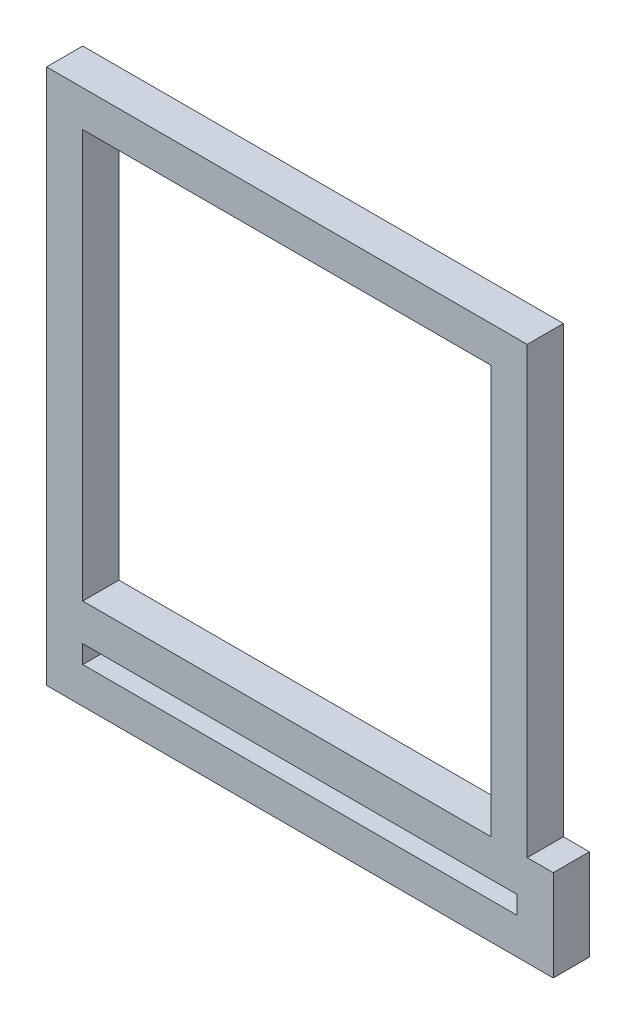
ISO-10303-21;
HEADER;
FILE_DESCRIPTION(('STEP AP214'),'2;1');
FILE_NAME('part.step','',(''),(''),'','','');
FILE_SCHEMA(('AUTOMOTIVE_DESIGN { 1 0 10303 214 1 1 1 1 }'));
ENDSEC;
DATA;
#1=APPLICATION_CONTEXT('core data for automotive mechanical design processes');
#2=APPLICATION_PROTOCOL_DEFINITION('international standard','automotive_design',2000,#1);
#3=PRODUCT_CONTEXT('',#1,'mechanical');
#4=PRODUCT('Part','Part','',(#3));
#5=PRODUCT_RELATED_PRODUCT_CATEGORY('part','',(#4));
#6=PRODUCT_DEFINITION_FORMATION('','',#4);
#7=PRODUCT_DEFINITION_CONTEXT('part definition',#1,'design');
#8=PRODUCT_DEFINITION('design','',#6,#7);
#9=PRODUCT_DEFINITION_SHAPE('','',#8);
#10=(LENGTH_UNIT() NAMED_UNIT(*) SI_UNIT(.MILLI.,.METRE.));
#11=(NAMED_UNIT(*) PLANE_ANGLE_UNIT() SI_UNIT($,.RADIAN.));
#12=(NAMED_UNIT(*) SI_UNIT($,.STERADIAN.) SOLID_ANGLE_UNIT());
#13=UNCERTAINTY_MEASURE_WITH_UNIT(LENGTH_MEASURE(1.E-05),#10,'distance_accuracy_value','');
#14=(GEOMETRIC_REPRESENTATION_CONTEXT(3) GLOBAL_UNCERTAINTY_ASSIGNED_CONTEXT((#13)) GLOBAL_UNIT_ASSIGNED_CONTEXT((#10,
#11,#12)) REPRESENTATION_CONTEXT('',''));
#15=CARTESIAN_POINT('',(0.,0.,0.));
#16=DIRECTION('',(0.,0.,1.));
#17=DIRECTION('',(1.,0.,0.));
#18=AXIS2_PLACEMENT_3D('',#15,#16,#17);
#19=CARTESIAN_POINT('',(0.,0.,5.));
#20=DIRECTION('',(1.,0.,0.));
#21=DIRECTION('',(0.,1.,0.));
#22=AXIS2_PLACEMENT_3D('',#19,#20,#21);
#23=PLANE('',#22);
#24=DIRECTION('',(0.,-1.,0.));
#25=VECTOR('',#24,1.);
#26=CARTESIAN_POINT('',(0.,0.,0.));
#27=LINE('',#26,#25);
#28=CARTESIAN_POINT('',(0.,74.,0.));
#29=VERTEX_POINT('',#28);
#30=CARTESIAN_POINT('',(0.,0.,0.));
#31=VERTEX_POINT('',#30);
#32=EDGE_CURVE('E161',#29,#31,#27,.T.);
#33=ORIENTED_EDGE('',*,*,#32,.T.);
#34=DIRECTION('',(0.,0.,-1.));
#35=VECTOR('',#34,1.);
#36=CARTESIAN_POINT('',(0.,0.,5.));
#37=LINE('',#36,#35);
#38=CARTESIAN_POINT('',(0.,0.,5.));
#39=VERTEX_POINT('',#38);
#40=EDGE_CURVE('E174',#39,#31,#37,.T.);
#41=ORIENTED_EDGE('',*,*,#40,.F.);
#42=DIRECTION('',(0.,-1.,0.));
#43=VECTOR('',#42,1.);
#44=CARTESIAN_POINT('',(0.,0.,5.));
#45=LINE('',#44,#43);
#46=CARTESIAN_POINT('',(0.,74.,5.));
#47=VERTEX_POINT('',#46);
#48=EDGE_CURVE('E157',#47,#39,#45,.T.);
#49=ORIENTED_EDGE('',*,*,#48,.F.);
#50=DIRECTION('',(0.,0.,-1.));
#51=VECTOR('',#50,1.);
#52=CARTESIAN_POINT('',(0.,74.,5.));
#53=LINE('',#52,#51);
#54=EDGE_CURVE('E155',#47,#29,#53,.T.);
#55=ORIENTED_EDGE('',*,*,#54,.T.);
#56=EDGE_LOOP('',(#33,#41,#49,#55));
#57=FACE_BOUND('',#56,.T.);
#58=ADVANCED_FACE('F31',(#57),#23,.F.);
#59=CARTESIAN_POINT('',(0.,0.,5.));
#60=DIRECTION('',(0.,1.,0.));
#61=DIRECTION('',(0.,0.,1.));
#62=AXIS2_PLACEMENT_3D('',#59,#60,#61);
#63=PLANE('',#62);
#64=DIRECTION('',(1.,0.,0.));
#65=VECTOR('',#64,1.);
#66=CARTESIAN_POINT('',(0.,0.,0.));
#67=LINE('',#66,#65);
#68=CARTESIAN_POINT('',(70.,0.,0.));
#69=VERTEX_POINT('',#68);
#70=EDGE_CURVE('E164',#31,#69,#67,.T.);
#71=ORIENTED_EDGE('',*,*,#70,.T.);
#72=DIRECTION('',(0.,0.,-1.));
#73=VECTOR('',#72,1.);
#74=CARTESIAN_POINT('',(70.,0.,5.));
#75=LINE('',#74,#73);
#76=CARTESIAN_POINT('',(70.,0.,5.));
#77=VERTEX_POINT('',#76);
#78=EDGE_CURVE('E172',#77,#69,#75,.T.);
#79=ORIENTED_EDGE('',*,*,#78,.F.);
#80=DIRECTION('',(1.,0.,0.));
#81=VECTOR('',#80,1.);
#82=CARTESIAN_POINT('',(0.,0.,5.));
#83=LINE('',#82,#81);
#84=EDGE_CURVE('E151',#39,#77,#83,.T.);
#85=ORIENTED_EDGE('',*,*,#84,.F.);
#86=ORIENTED_EDGE('',*,*,#40,.T.);
#87=EDGE_LOOP('',(#71,#79,#85,#86));
#88=FACE_BOUND('',#87,.T.);
#89=ADVANCED_FACE('F251',(#88),#63,.F.);
#90=CARTESIAN_POINT('',(70.,0.,5.));
#91=DIRECTION('',(-1.,0.,0.));
#92=DIRECTION('',(0.,-1.,0.));
#93=AXIS2_PLACEMENT_3D('',#90,#91,#92);
#94=PLANE('',#93);
#95=DIRECTION('',(0.,1.,0.));
#96=VECTOR('',#95,1.);
#97=CARTESIAN_POINT('',(70.,0.,0.));
#98=LINE('',#97,#96);
#99=CARTESIAN_POINT('',(70.,12.6,0.));
#100=VERTEX_POINT('',#99);
#101=EDGE_CURVE('E147',#69,#100,#98,.T.);
#102=ORIENTED_EDGE('',*,*,#101,.T.);
#103=DIRECTION('',(0.,0.,-1.));
#104=VECTOR('',#103,1.);
#105=CARTESIAN_POINT('',(70.,12.6,5.));
#106=LINE('',#105,#104);
#107=CARTESIAN_POINT('',(70.,12.6,5.));
#108=VERTEX_POINT('',#107);
#109=EDGE_CURVE('E45',#108,#100,#106,.T.);
#110=ORIENTED_EDGE('',*,*,#109,.F.);
#111=DIRECTION('',(0.,1.,0.));
#112=VECTOR('',#111,1.);
#113=CARTESIAN_POINT('',(70.,0.,5.));
#114=LINE('',#113,#112);
#115=EDGE_CURVE('E145',#77,#108,#114,.T.);
#116=ORIENTED_EDGE('',*,*,#115,.F.);
#117=ORIENTED_EDGE('',*,*,#78,.T.);
#118=EDGE_LOOP('',(#102,#110,#116,#117));
#119=FACE_BOUND('',#118,.T.);
#120=ADVANCED_FACE('F143',(#119),#94,.F.);
#121=CARTESIAN_POINT('',(0.,74.,5.));
#122=DIRECTION('',(0.,-1.,0.));
#123=DIRECTION('',(0.,0.,-1.));
#124=AXIS2_PLACEMENT_3D('',#121,#122,#123);
#125=PLANE('',#124);
#126=DIRECTION('',(-1.,0.,0.));
#127=VECTOR('',#126,1.);
#128=CARTESIAN_POINT('',(0.,74.,5.));
#129=LINE('',#128,#127);
#130=CARTESIAN_POINT('',(66.4,74.,5.));
#131=VERTEX_POINT('',#130);
#132=EDGE_CURVE('E153',#131,#47,#129,.T.);
#133=ORIENTED_EDGE('',*,*,#132,.F.);
#134=DIRECTION('',(0.,0.,-1.));
#135=VECTOR('',#134,1.);
#136=CARTESIAN_POINT('',(66.4,74.,5.));
#137=LINE('',#136,#135);
#138=CARTESIAN_POINT('',(66.4,74.,0.));
#139=VERTEX_POINT('',#138);
#140=EDGE_CURVE('E260',#131,#139,#137,.T.);
#141=ORIENTED_EDGE('',*,*,#140,.T.);
#142=DIRECTION('',(-1.,0.,0.));
#143=VECTOR('',#142,1.);
#144=CARTESIAN_POINT('',(0.,74.,0.));
#145=LINE('',#144,#143);
#146=EDGE_CURVE('E168',#139,#29,#145,.T.);
#147=ORIENTED_EDGE('',*,*,#146,.T.);
#148=ORIENTED_EDGE('',*,*,#54,.F.);
#149=EDGE_LOOP('',(#133,#141,#147,#148));
#150=FACE_BOUND('',#149,.T.);
#151=ADVANCED_FACE('F271',(#150),#125,.F.);
#152=CARTESIAN_POINT('',(0.,74.,5.));
#153=DIRECTION('',(0.,0.,-1.));
#154=DIRECTION('',(-1.,0.,0.));
#155=AXIS2_PLACEMENT_3D('',#152,#153,#154);
#156=PLANE('',#155);
#157=DIRECTION('',(1.,0.,0.));
#158=VECTOR('',#157,1.);
#159=CARTESIAN_POINT('',(4.99999999999997,12.6,5.));
#160=LINE('',#159,#158);
#161=CARTESIAN_POINT('',(4.99999999999997,12.6,5.));
#162=VERTEX_POINT('',#161);
#163=CARTESIAN_POINT('',(61.4,12.6,5.));
#164=VERTEX_POINT('',#163);
#165=EDGE_CURVE('E265',#162,#164,#160,.T.);
#166=ORIENTED_EDGE('',*,*,#165,.F.);
#167=DIRECTION('',(0.,-1.,0.));
#168=VECTOR('',#167,1.);
#169=CARTESIAN_POINT('',(4.99999999999996,69.,5.));
#170=LINE('',#169,#168);
#171=CARTESIAN_POINT('',(4.99999999999996,69.,5.));
#172=VERTEX_POINT('',#171);
#173=EDGE_CURVE('E53',#172,#162,#170,.T.);
#174=ORIENTED_EDGE('',*,*,#173,.F.);
#175=DIRECTION('',(-1.,0.,0.));
#176=VECTOR('',#175,1.);
#177=CARTESIAN_POINT('',(4.99999999999996,69.,5.));
#178=LINE('',#177,#176);
#179=CARTESIAN_POINT('',(61.4,69.,5.));
#180=VERTEX_POINT('',#179);
#181=EDGE_CURVE('E209',#180,#172,#178,.T.);
#182=ORIENTED_EDGE('',*,*,#181,.F.);
#183=DIRECTION('',(0.,1.,0.));
#184=VECTOR('',#183,1.);
#185=CARTESIAN_POINT('',(61.4,69.,5.));
#186=LINE('',#185,#184);
#187=EDGE_CURVE('E197',#164,#180,#186,.T.);
#188=ORIENTED_EDGE('',*,*,#187,.F.);
#189=EDGE_LOOP('',(#166,#174,#182,#188));
#190=FACE_BOUND('',#189,.T.);
#191=DIRECTION('',(1.,0.,0.));
#192=VECTOR('',#191,1.);
#193=CARTESIAN_POINT('',(5.,5.,5.));
#194=LINE('',#193,#192);
#195=CARTESIAN_POINT('',(5.,5.,5.));
#196=VERTEX_POINT('',#195);
#197=CARTESIAN_POINT('',(65.,5.,5.));
#198=VERTEX_POINT('',#197);
#199=EDGE_CURVE('E225',#196,#198,#194,.T.);
#200=ORIENTED_EDGE('',*,*,#199,.F.);
#201=DIRECTION('',(0.,-1.,0.));
#202=VECTOR('',#201,1.);
#203=CARTESIAN_POINT('',(5.,7.5,5.));
#204=LINE('',#203,#202);
#205=CARTESIAN_POINT('',(5.,7.5,5.));
#206=VERTEX_POINT('',#205);
#207=EDGE_CURVE('E223',#206,#196,#204,.T.);
#208=ORIENTED_EDGE('',*,*,#207,.F.);
#209=DIRECTION('',(-1.,0.,0.));
#210=VECTOR('',#209,1.);
#211=CARTESIAN_POINT('',(5.,7.5,5.));
#212=LINE('',#211,#210);
#213=CARTESIAN_POINT('',(65.,7.5,5.));
#214=VERTEX_POINT('',#213);
#215=EDGE_CURVE('E231',#214,#206,#212,.T.);
#216=ORIENTED_EDGE('',*,*,#215,.F.);
#217=DIRECTION('',(0.,1.,0.));
#218=VECTOR('',#217,1.);
#219=CARTESIAN_POINT('',(65.,7.5,5.));
#220=LINE('',#219,#218);
#221=EDGE_CURVE('E228',#198,#214,#220,.T.);
#222=ORIENTED_EDGE('',*,*,#221,.F.);
#223=EDGE_LOOP('',(#200,#208,#216,#222));
#224=FACE_BOUND('',#223,.T.);
#225=DIRECTION('',(-1.,0.,0.));
#226=VECTOR('',#225,1.);
#227=CARTESIAN_POINT('',(70.,12.6,5.));
#228=LINE('',#227,#226);
#229=CARTESIAN_POINT('',(66.3999999999999,12.6,5.));
#230=VERTEX_POINT('',#229);
#231=EDGE_CURVE('E130',#108,#230,#228,.T.);
#232=ORIENTED_EDGE('',*,*,#231,.T.);
#233=DIRECTION('',(0.,1.,0.));
#234=VECTOR('',#233,1.);
#235=CARTESIAN_POINT('',(66.4,74.,5.));
#236=LINE('',#235,#234);
#237=EDGE_CURVE('E137',#230,#131,#236,.T.);
#238=ORIENTED_EDGE('',*,*,#237,.T.);
#239=ORIENTED_EDGE('',*,*,#132,.T.);
#240=ORIENTED_EDGE('',*,*,#48,.T.);
#241=ORIENTED_EDGE('',*,*,#84,.T.);
#242=ORIENTED_EDGE('',*,*,#115,.T.);
#243=EDGE_LOOP('',(#232,#238,#239,#240,#241,#242));
#244=FACE_BOUND('',#243,.T.);
#245=ADVANCED_FACE('F149',(#190,#224,#244),#156,.F.);
#246=CARTESIAN_POINT('',(0.,74.,0.));
#247=DIRECTION('',(0.,0.,-1.));
#248=DIRECTION('',(-1.,0.,0.));
#249=AXIS2_PLACEMENT_3D('',#246,#247,#248);
#250=PLANE('',#249);
#251=DIRECTION('',(0.,1.,0.));
#252=VECTOR('',#251,1.);
#253=CARTESIAN_POINT('',(66.4,74.,0.));
#254=LINE('',#253,#252);
#255=CARTESIAN_POINT('',(66.3999999999999,12.6,0.));
#256=VERTEX_POINT('',#255);
#257=EDGE_CURVE('E138',#256,#139,#254,.T.);
#258=ORIENTED_EDGE('',*,*,#257,.F.);
#259=DIRECTION('',(-1.,0.,0.));
#260=VECTOR('',#259,1.);
#261=CARTESIAN_POINT('',(70.,12.6,0.));
#262=LINE('',#261,#260);
#263=EDGE_CURVE('E254',#100,#256,#262,.T.);
#264=ORIENTED_EDGE('',*,*,#263,.F.);
#265=ORIENTED_EDGE('',*,*,#101,.F.);
#266=ORIENTED_EDGE('',*,*,#70,.F.);
#267=ORIENTED_EDGE('',*,*,#32,.F.);
#268=ORIENTED_EDGE('',*,*,#146,.F.);
#269=EDGE_LOOP('',(#258,#264,#265,#266,#267,#268));
#270=FACE_BOUND('',#269,.T.);
#271=DIRECTION('',(0.,1.,0.));
#272=VECTOR('',#271,1.);
#273=CARTESIAN_POINT('',(4.99999999999996,74.,0.));
#274=LINE('',#273,#272);
#275=CARTESIAN_POINT('',(4.99999999999997,12.6,0.));
#276=VERTEX_POINT('',#275);
#277=CARTESIAN_POINT('',(4.99999999999996,69.,0.));
#278=VERTEX_POINT('',#277);
#279=EDGE_CURVE('E11',#276,#278,#274,.T.);
#280=ORIENTED_EDGE('',*,*,#279,.F.);
#281=DIRECTION('',(-1.,0.,0.));
#282=VECTOR('',#281,1.);
#283=CARTESIAN_POINT('',(0.,12.6,0.));
#284=LINE('',#283,#282);
#285=CARTESIAN_POINT('',(61.4,12.6,0.));
#286=VERTEX_POINT('',#285);
#287=EDGE_CURVE('E177',#286,#276,#284,.T.);
#288=ORIENTED_EDGE('',*,*,#287,.F.);
#289=DIRECTION('',(0.,-1.,0.));
#290=VECTOR('',#289,1.);
#291=CARTESIAN_POINT('',(61.4,74.,0.));
#292=LINE('',#291,#290);
#293=CARTESIAN_POINT('',(61.4,69.,0.));
#294=VERTEX_POINT('',#293);
#295=EDGE_CURVE('E179',#294,#286,#292,.T.);
#296=ORIENTED_EDGE('',*,*,#295,.F.);
#297=DIRECTION('',(1.,0.,0.));
#298=VECTOR('',#297,1.);
#299=CARTESIAN_POINT('',(0.,69.,0.));
#300=LINE('',#299,#298);
#301=EDGE_CURVE('E38',#278,#294,#300,.T.);
#302=ORIENTED_EDGE('',*,*,#301,.F.);
#303=EDGE_LOOP('',(#280,#288,#296,#302));
#304=FACE_BOUND('',#303,.T.);
#305=DIRECTION('',(0.,-1.,0.));
#306=VECTOR('',#305,1.);
#307=CARTESIAN_POINT('',(5.,7.5,0.));
#308=LINE('',#307,#306);
#309=CARTESIAN_POINT('',(5.,7.5,0.));
#310=VERTEX_POINT('',#309);
#311=CARTESIAN_POINT('',(5.,5.,0.));
#312=VERTEX_POINT('',#311);
#313=EDGE_CURVE('E220',#310,#312,#308,.T.);
#314=ORIENTED_EDGE('',*,*,#313,.T.);
#315=DIRECTION('',(1.,0.,0.));
#316=VECTOR('',#315,1.);
#317=CARTESIAN_POINT('',(5.,5.,0.));
#318=LINE('',#317,#316);
#319=CARTESIAN_POINT('',(65.,5.,0.));
#320=VERTEX_POINT('',#319);
#321=EDGE_CURVE('E165',#312,#320,#318,.T.);
#322=ORIENTED_EDGE('',*,*,#321,.T.);
#323=DIRECTION('',(0.,1.,0.));
#324=VECTOR('',#323,1.);
#325=CARTESIAN_POINT('',(65.,7.5,0.));
#326=LINE('',#325,#324);
#327=CARTESIAN_POINT('',(65.,7.5,0.));
#328=VERTEX_POINT('',#327);
#329=EDGE_CURVE('E214',#320,#328,#326,.T.);
#330=ORIENTED_EDGE('',*,*,#329,.T.);
#331=DIRECTION('',(-1.,0.,0.));
#332=VECTOR('',#331,1.);
#333=CARTESIAN_POINT('',(5.,7.5,0.));
#334=LINE('',#333,#332);
#335=EDGE_CURVE('E217',#328,#310,#334,.T.);
#336=ORIENTED_EDGE('',*,*,#335,.T.);
#337=EDGE_LOOP('',(#314,#322,#330,#336));
#338=FACE_BOUND('',#337,.T.);
#339=ADVANCED_FACE('F201',(#270,#304,#338),#250,.T.);
#340=CARTESIAN_POINT('',(5.,7.5,-0.00100000000000013));
#341=DIRECTION('',(-1.,0.,0.));
#342=DIRECTION('',(0.,0.,1.));
#343=AXIS2_PLACEMENT_3D('',#340,#341,#342);
#344=PLANE('',#343);
#345=DIRECTION('',(0.,0.,1.));
#346=VECTOR('',#345,1.);
#347=CARTESIAN_POINT('',(5.,7.5,-0.00100000000000013));
#348=LINE('',#347,#346);
#349=EDGE_CURVE('E235',#310,#206,#348,.T.);
#350=ORIENTED_EDGE('',*,*,#349,.T.);
#351=ORIENTED_EDGE('',*,*,#207,.T.);
#352=DIRECTION('',(0.,0.,1.));
#353=VECTOR('',#352,1.);
#354=CARTESIAN_POINT('',(5.,5.,-0.00100000000000013));
#355=LINE('',#354,#353);
#356=EDGE_CURVE('E234',#312,#196,#355,.T.);
#357=ORIENTED_EDGE('',*,*,#356,.F.);
#358=ORIENTED_EDGE('',*,*,#313,.F.);
#359=EDGE_LOOP('',(#350,#351,#357,#358));
#360=FACE_BOUND('',#359,.T.);
#361=ADVANCED_FACE('F282',(#360),#344,.F.);
#362=CARTESIAN_POINT('',(5.,7.5,-0.00100000000000013));
#363=DIRECTION('',(0.,1.,0.));
#364=DIRECTION('',(0.,0.,1.));
#365=AXIS2_PLACEMENT_3D('',#362,#363,#364);
#366=PLANE('',#365);
#367=DIRECTION('',(0.,0.,1.));
#368=VECTOR('',#367,1.);
#369=CARTESIAN_POINT('',(65.,7.5,-0.00100000000000013));
#370=LINE('',#369,#368);
#371=EDGE_CURVE('E237',#328,#214,#370,.T.);
#372=ORIENTED_EDGE('',*,*,#371,.T.);
#373=ORIENTED_EDGE('',*,*,#215,.T.);
#374=ORIENTED_EDGE('',*,*,#349,.F.);
#375=ORIENTED_EDGE('',*,*,#335,.F.);
#376=EDGE_LOOP('',(#372,#373,#374,#375));
#377=FACE_BOUND('',#376,.T.);
#378=ADVANCED_FACE('F286',(#377),#366,.F.);
#379=CARTESIAN_POINT('',(65.,7.5,-0.00100000000000013));
#380=DIRECTION('',(1.,0.,0.));
#381=DIRECTION('',(0.,0.,-1.));
#382=AXIS2_PLACEMENT_3D('',#379,#380,#381);
#383=PLANE('',#382);
#384=DIRECTION('',(0.,0.,1.));
#385=VECTOR('',#384,1.);
#386=CARTESIAN_POINT('',(65.,5.,-0.00100000000000013));
#387=LINE('',#386,#385);
#388=EDGE_CURVE('E239',#320,#198,#387,.T.);
#389=ORIENTED_EDGE('',*,*,#388,.T.);
#390=ORIENTED_EDGE('',*,*,#221,.T.);
#391=ORIENTED_EDGE('',*,*,#371,.F.);
#392=ORIENTED_EDGE('',*,*,#329,.F.);
#393=EDGE_LOOP('',(#389,#390,#391,#392));
#394=FACE_BOUND('',#393,.T.);
#395=ADVANCED_FACE('F288',(#394),#383,.F.);
#396=CARTESIAN_POINT('',(5.,5.,-0.00100000000000013));
#397=DIRECTION('',(0.,-1.,0.));
#398=DIRECTION('',(0.,0.,-1.));
#399=AXIS2_PLACEMENT_3D('',#396,#397,#398);
#400=PLANE('',#399);
#401=ORIENTED_EDGE('',*,*,#356,.T.);
#402=ORIENTED_EDGE('',*,*,#199,.T.);
#403=ORIENTED_EDGE('',*,*,#388,.F.);
#404=ORIENTED_EDGE('',*,*,#321,.F.);
#405=EDGE_LOOP('',(#401,#402,#403,#404));
#406=FACE_BOUND('',#405,.T.);
#407=ADVANCED_FACE('F278',(#406),#400,.F.);
#408=CARTESIAN_POINT('',(4.99999999999996,69.,-15.));
#409=DIRECTION('',(-1.,0.,0.));
#410=DIRECTION('',(0.,-1.,0.));
#411=AXIS2_PLACEMENT_3D('',#408,#409,#410);
#412=PLANE('',#411);
#413=ORIENTED_EDGE('',*,*,#279,.T.);
#414=DIRECTION('',(0.,0.,1.));
#415=VECTOR('',#414,1.);
#416=CARTESIAN_POINT('',(4.99999999999996,69.,-15.));
#417=LINE('',#416,#415);
#418=EDGE_CURVE('E189',#278,#172,#417,.T.);
#419=ORIENTED_EDGE('',*,*,#418,.T.);
#420=ORIENTED_EDGE('',*,*,#173,.T.);
#421=DIRECTION('',(0.,0.,1.));
#422=VECTOR('',#421,1.);
#423=CARTESIAN_POINT('',(4.99999999999997,12.6,-15.));
#424=LINE('',#423,#422);
#425=EDGE_CURVE('E206',#276,#162,#424,.T.);
#426=ORIENTED_EDGE('',*,*,#425,.F.);
#427=EDGE_LOOP('',(#413,#419,#420,#426));
#428=FACE_BOUND('',#427,.T.);
#429=ADVANCED_FACE('F208',(#428),#412,.F.);
#430=CARTESIAN_POINT('',(4.99999999999996,69.,-15.));
#431=DIRECTION('',(0.,1.,0.));
#432=DIRECTION('',(0.,0.,1.));
#433=AXIS2_PLACEMENT_3D('',#430,#431,#432);
#434=PLANE('',#433);
#435=ORIENTED_EDGE('',*,*,#301,.T.);
#436=DIRECTION('',(0.,0.,1.));
#437=VECTOR('',#436,1.);
#438=CARTESIAN_POINT('',(61.4,69.,-15.));
#439=LINE('',#438,#437);
#440=EDGE_CURVE('E187',#294,#180,#439,.T.);
#441=ORIENTED_EDGE('',*,*,#440,.T.);
#442=ORIENTED_EDGE('',*,*,#181,.T.);
#443=ORIENTED_EDGE('',*,*,#418,.F.);
#444=EDGE_LOOP('',(#435,#441,#442,#443));
#445=FACE_BOUND('',#444,.T.);
#446=ADVANCED_FACE('F185',(#445),#434,.F.);
#447=CARTESIAN_POINT('',(61.4,69.,-15.));
#448=DIRECTION('',(1.,0.,0.));
#449=DIRECTION('',(0.,1.,0.));
#450=AXIS2_PLACEMENT_3D('',#447,#448,#449);
#451=PLANE('',#450);
#452=ORIENTED_EDGE('',*,*,#295,.T.);
#453=DIRECTION('',(0.,0.,1.));
#454=VECTOR('',#453,1.);
#455=CARTESIAN_POINT('',(61.4,12.6,-15.));
#456=LINE('',#455,#454);
#457=EDGE_CURVE('E199',#286,#164,#456,.T.);
#458=ORIENTED_EDGE('',*,*,#457,.T.);
#459=ORIENTED_EDGE('',*,*,#187,.T.);
#460=ORIENTED_EDGE('',*,*,#440,.F.);
#461=EDGE_LOOP('',(#452,#458,#459,#460));
#462=FACE_BOUND('',#461,.T.);
#463=ADVANCED_FACE('F194',(#462),#451,.F.);
#464=CARTESIAN_POINT('',(4.99999999999997,12.6,-15.));
#465=DIRECTION('',(0.,-1.,0.));
#466=DIRECTION('',(0.,0.,-1.));
#467=AXIS2_PLACEMENT_3D('',#464,#465,#466);
#468=PLANE('',#467);
#469=ORIENTED_EDGE('',*,*,#287,.T.);
#470=ORIENTED_EDGE('',*,*,#425,.T.);
#471=ORIENTED_EDGE('',*,*,#165,.T.);
#472=ORIENTED_EDGE('',*,*,#457,.F.);
#473=EDGE_LOOP('',(#469,#470,#471,#472));
#474=FACE_BOUND('',#473,.T.);
#475=ADVANCED_FACE('F204',(#474),#468,.F.);
#476=CARTESIAN_POINT('',(66.4,74.,5.));
#477=DIRECTION('',(-1.,0.,0.));
#478=DIRECTION('',(0.,-1.,0.));
#479=AXIS2_PLACEMENT_3D('',#476,#477,#478);
#480=PLANE('',#479);
#481=ORIENTED_EDGE('',*,*,#257,.T.);
#482=ORIENTED_EDGE('',*,*,#140,.F.);
#483=ORIENTED_EDGE('',*,*,#237,.F.);
#484=DIRECTION('',(0.,0.,-1.));
#485=VECTOR('',#484,1.);
#486=CARTESIAN_POINT('',(66.3999999999999,12.6,5.));
#487=LINE('',#486,#485);
#488=EDGE_CURVE('E132',#230,#256,#487,.T.);
#489=ORIENTED_EDGE('',*,*,#488,.T.);
#490=EDGE_LOOP('',(#481,#482,#483,#489));
#491=FACE_BOUND('',#490,.T.);
#492=ADVANCED_FACE('F363',(#491),#480,.F.);
#493=CARTESIAN_POINT('',(70.,12.6,5.));
#494=DIRECTION('',(0.,-1.,0.));
#495=DIRECTION('',(0.,0.,-1.));
#496=AXIS2_PLACEMENT_3D('',#493,#494,#495);
#497=PLANE('',#496);
#498=ORIENTED_EDGE('',*,*,#263,.T.);
#499=ORIENTED_EDGE('',*,*,#488,.F.);
#500=ORIENTED_EDGE('',*,*,#231,.F.);
#501=ORIENTED_EDGE('',*,*,#109,.T.);
#502=EDGE_LOOP('',(#498,#499,#500,#501));
#503=FACE_BOUND('',#502,.T.);
#504=ADVANCED_FACE('F131',(#503),#497,.F.);
#505=CLOSED_SHELL('',(#58,#89,#120,#151,#245,#339,#361,#378,#395,#407,#429,#446,#463,#475,#492,#504));
#506=MANIFOLD_SOLID_BREP('B2',#505);
#507=ADVANCED_BREP_SHAPE_REPRESENTATION('',(#18,#506),#14);
#508=SHAPE_DEFINITION_REPRESENTATION(#9,#507);
ENDSEC;
END-ISO-10303-21;
